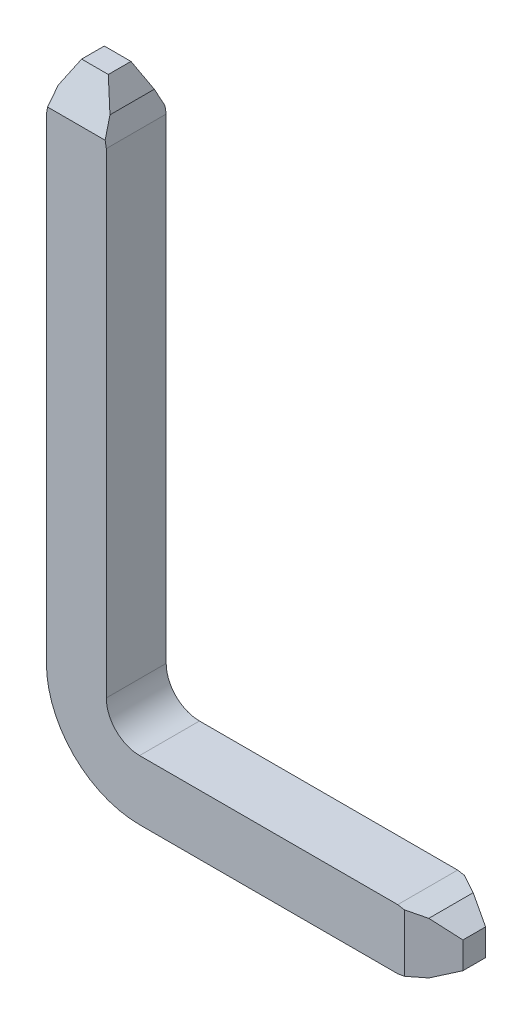
ISO-10303-21;
HEADER;
FILE_DESCRIPTION(('STEP AP214'),'2;1');
FILE_NAME('part.step','',(''),(''),'','','');
FILE_SCHEMA(('AUTOMOTIVE_DESIGN { 1 0 10303 214 1 1 1 1 }'));
ENDSEC;
DATA;
#1=APPLICATION_CONTEXT('core data for automotive mechanical design processes');
#2=APPLICATION_PROTOCOL_DEFINITION('international standard','automotive_design',2000,#1);
#3=PRODUCT_CONTEXT('',#1,'mechanical');
#4=PRODUCT('Part','Part','',(#3));
#5=PRODUCT_RELATED_PRODUCT_CATEGORY('part','',(#4));
#6=PRODUCT_DEFINITION_FORMATION('','',#4);
#7=PRODUCT_DEFINITION_CONTEXT('part definition',#1,'design');
#8=PRODUCT_DEFINITION('design','',#6,#7);
#9=PRODUCT_DEFINITION_SHAPE('','',#8);
#10=(LENGTH_UNIT() NAMED_UNIT(*) SI_UNIT(.MILLI.,.METRE.));
#11=(NAMED_UNIT(*) PLANE_ANGLE_UNIT() SI_UNIT($,.RADIAN.));
#12=(NAMED_UNIT(*) SI_UNIT($,.STERADIAN.) SOLID_ANGLE_UNIT());
#13=UNCERTAINTY_MEASURE_WITH_UNIT(LENGTH_MEASURE(1.E-05),#10,'distance_accuracy_value','');
#14=(GEOMETRIC_REPRESENTATION_CONTEXT(3) GLOBAL_UNCERTAINTY_ASSIGNED_CONTEXT((#13)) GLOBAL_UNIT_ASSIGNED_CONTEXT((#10,
#11,#12)) REPRESENTATION_CONTEXT('',''));
#15=CARTESIAN_POINT('',(0.,0.,0.));
#16=DIRECTION('',(0.,0.,1.));
#17=DIRECTION('',(1.,0.,0.));
#18=AXIS2_PLACEMENT_3D('',#15,#16,#17);
#19=CARTESIAN_POINT('',(7.02309999999993,12.4271795773165,0.571499999999999));
#20=DIRECTION('',(-1.,0.,0.));
#21=DIRECTION('',(0.,-1.,0.));
#22=AXIS2_PLACEMENT_3D('',#19,#20,#21);
#23=PLANE('',#22);
#24=DIRECTION('',(0.,1.,0.));
#25=VECTOR('',#24,1.);
#26=CARTESIAN_POINT('',(7.02309999999998,11.176,0.216173564485865));
#27=LINE('',#26,#25);
#28=CARTESIAN_POINT('',(7.02309999999999,0.254384160478297,0.216173564485887));
#29=VERTEX_POINT('',#28);
#30=CARTESIAN_POINT('',(7.02309999999999,-0.254384160478395,0.216173564485863));
#31=VERTEX_POINT('',#30);
#32=EDGE_CURVE('E279',#29,#31,#27,.F.);
#33=ORIENTED_EDGE('',*,*,#32,.T.);
#34=DIRECTION('',(0.,0.,1.));
#35=VECTOR('',#34,1.);
#36=CARTESIAN_POINT('',(7.0231,-0.254384160478396,-0.571500000000001));
#37=LINE('',#36,#35);
#38=CARTESIAN_POINT('',(7.02309999999998,-0.254384160478394,-0.216173564485855));
#39=VERTEX_POINT('',#38);
#40=EDGE_CURVE('E234',#31,#39,#37,.F.);
#41=ORIENTED_EDGE('',*,*,#40,.T.);
#42=DIRECTION('',(0.,1.,0.));
#43=VECTOR('',#42,1.);
#44=CARTESIAN_POINT('',(7.02309999999999,11.176,-0.216173564485864));
#45=LINE('',#44,#43);
#46=CARTESIAN_POINT('',(7.02309999999998,0.254384160478297,-0.216173564485839));
#47=VERTEX_POINT('',#46);
#48=EDGE_CURVE('E222',#39,#47,#45,.T.);
#49=ORIENTED_EDGE('',*,*,#48,.T.);
#50=DIRECTION('',(0.,0.,1.));
#51=VECTOR('',#50,1.);
#52=CARTESIAN_POINT('',(7.02309999999999,0.254384160478297,-0.571500000000001));
#53=LINE('',#52,#51);
#54=EDGE_CURVE('E233',#47,#29,#53,.T.);
#55=ORIENTED_EDGE('',*,*,#54,.T.);
#56=EDGE_LOOP('',(#33,#41,#49,#55));
#57=FACE_BOUND('',#56,.T.);
#58=ADVANCED_FACE('F15',(#57),#23,.F.);
#59=CARTESIAN_POINT('',(6.5786,-0.493122657075138,-0.571500000000001));
#60=DIRECTION('',(-0.473165915539226,0.880973334654305,0.));
#61=DIRECTION('',(-0.880973334654305,-0.473165915539226,0.));
#62=AXIS2_PLACEMENT_3D('',#59,#60,#61);
#63=PLANE('',#62);
#64=DIRECTION('',(-0.814891923823506,-0.437673954516204,0.379990344647562));
#65=VECTOR('',#64,1.);
#66=CARTESIAN_POINT('',(7.02309999999998,-0.254384160478393,0.216173564485836));
#67=LINE('',#66,#65);
#68=CARTESIAN_POINT('',(6.57859999999999,-0.493122657075138,0.42344731853576));
#69=VERTEX_POINT('',#68);
#70=EDGE_CURVE('E257',#31,#69,#67,.T.);
#71=ORIENTED_EDGE('',*,*,#70,.T.);
#72=DIRECTION('',(0.,0.,1.));
#73=VECTOR('',#72,1.);
#74=CARTESIAN_POINT('',(6.5786,-0.49312265707514,-0.571500000000001));
#75=LINE('',#74,#73);
#76=CARTESIAN_POINT('',(6.57859999999999,-0.493122657075139,-0.423447318535771));
#77=VERTEX_POINT('',#76);
#78=EDGE_CURVE('E196',#69,#77,#75,.F.);
#79=ORIENTED_EDGE('',*,*,#78,.T.);
#80=DIRECTION('',(0.814891923823506,0.437673954516204,0.379990344647562));
#81=VECTOR('',#80,1.);
#82=CARTESIAN_POINT('',(6.57859999999997,-0.493122657075138,-0.423447318535736));
#83=LINE('',#82,#81);
#84=EDGE_CURVE('E254',#77,#39,#83,.T.);
#85=ORIENTED_EDGE('',*,*,#84,.T.);
#86=ORIENTED_EDGE('',*,*,#40,.F.);
#87=EDGE_LOOP('',(#71,#79,#85,#86));
#88=FACE_BOUND('',#87,.T.);
#89=ADVANCED_FACE('F545',(#88),#63,.F.);
#90=CARTESIAN_POINT('',(6.57859999999999,0.493122657075042,-0.571500000000001));
#91=DIRECTION('',(-0.473165915539233,-0.880973334654301,0.));
#92=DIRECTION('',(0.880973334654301,-0.473165915539233,0.));
#93=AXIS2_PLACEMENT_3D('',#90,#91,#92);
#94=PLANE('',#93);
#95=DIRECTION('',(0.814891923823507,-0.4376739545162,-0.379990344647564));
#96=VECTOR('',#95,1.);
#97=CARTESIAN_POINT('',(6.57859999999997,0.493122657075042,0.42344731853574));
#98=LINE('',#97,#96);
#99=CARTESIAN_POINT('',(6.57859999999998,0.493122657075042,0.423447318535775));
#100=VERTEX_POINT('',#99);
#101=EDGE_CURVE('E247',#100,#29,#98,.T.);
#102=ORIENTED_EDGE('',*,*,#101,.T.);
#103=ORIENTED_EDGE('',*,*,#54,.F.);
#104=DIRECTION('',(-0.814891923823508,0.437673954516198,-0.379990344647565));
#105=VECTOR('',#104,1.);
#106=CARTESIAN_POINT('',(7.02309999999997,0.254384160478301,-0.216173564485842));
#107=LINE('',#106,#105);
#108=CARTESIAN_POINT('',(6.57859999999998,0.493122657075042,-0.423447318535773));
#109=VERTEX_POINT('',#108);
#110=EDGE_CURVE('E209',#47,#109,#107,.T.);
#111=ORIENTED_EDGE('',*,*,#110,.T.);
#112=DIRECTION('',(0.,0.,1.));
#113=VECTOR('',#112,1.);
#114=CARTESIAN_POINT('',(6.57859999999999,0.493122657075041,-0.571500000000001));
#115=LINE('',#114,#113);
#116=EDGE_CURVE('E218',#109,#100,#115,.T.);
#117=ORIENTED_EDGE('',*,*,#116,.T.);
#118=EDGE_LOOP('',(#102,#103,#111,#117));
#119=FACE_BOUND('',#118,.T.);
#120=ADVANCED_FACE('F537',(#119),#94,.F.);
#121=CARTESIAN_POINT('',(7.02309999999994,11.176,0.216173564485887));
#122=DIRECTION('',(-0.422618261740701,0.,-0.906307787036649));
#123=DIRECTION('',(-0.906307787036649,0.,0.422618261740701));
#124=AXIS2_PLACEMENT_3D('',#121,#122,#123);
#125=PLANE('',#124);
#126=ORIENTED_EDGE('',*,*,#32,.F.);
#127=ORIENTED_EDGE('',*,*,#101,.F.);
#128=DIRECTION('',(-0.894952131932454,0.157804207302252,0.417323032802243));
#129=VECTOR('',#128,1.);
#130=CARTESIAN_POINT('',(6.57859999999999,0.493122657075041,0.423447318535787));
#131=LINE('',#130,#129);
#132=CARTESIAN_POINT('',(6.26109999999999,0.549106473449978,0.571499999999981));
#133=VERTEX_POINT('',#132);
#134=EDGE_CURVE('E213',#100,#133,#131,.T.);
#135=ORIENTED_EDGE('',*,*,#134,.T.);
#136=DIRECTION('',(0.,1.,0.));
#137=VECTOR('',#136,1.);
#138=CARTESIAN_POINT('',(6.26109999999999,11.176,0.571499999999973));
#139=LINE('',#138,#137);
#140=CARTESIAN_POINT('',(6.26109999999999,-0.549106473450073,0.571499999999981));
#141=VERTEX_POINT('',#140);
#142=EDGE_CURVE('E244',#141,#133,#139,.T.);
#143=ORIENTED_EDGE('',*,*,#142,.F.);
#144=DIRECTION('',(0.894952131932453,0.157804207302242,-0.41732303280225));
#145=VECTOR('',#144,1.);
#146=CARTESIAN_POINT('',(6.2611,-0.549106473450073,0.571499999999997));
#147=LINE('',#146,#145);
#148=EDGE_CURVE('E238',#141,#69,#147,.T.);
#149=ORIENTED_EDGE('',*,*,#148,.T.);
#150=ORIENTED_EDGE('',*,*,#70,.F.);
#151=EDGE_LOOP('',(#126,#127,#135,#143,#149,#150));
#152=FACE_BOUND('',#151,.T.);
#153=ADVANCED_FACE('F530',(#152),#125,.F.);
#154=CARTESIAN_POINT('',(7.02309999999994,11.176,-0.216173564485889));
#155=DIRECTION('',(-0.422618261740702,0.,0.906307787036649));
#156=DIRECTION('',(0.906307787036649,0.,0.422618261740702));
#157=AXIS2_PLACEMENT_3D('',#154,#155,#156);
#158=PLANE('',#157);
#159=DIRECTION('',(0.894952131932453,-0.157804207302252,0.417323032802247));
#160=VECTOR('',#159,1.);
#161=CARTESIAN_POINT('',(6.26109999999999,0.549106473449978,-0.571500000000001));
#162=LINE('',#161,#160);
#163=CARTESIAN_POINT('',(6.26109999999999,0.549106473449979,-0.5715));
#164=VERTEX_POINT('',#163);
#165=EDGE_CURVE('E190',#164,#109,#162,.T.);
#166=ORIENTED_EDGE('',*,*,#165,.T.);
#167=ORIENTED_EDGE('',*,*,#110,.F.);
#168=ORIENTED_EDGE('',*,*,#48,.F.);
#169=ORIENTED_EDGE('',*,*,#84,.F.);
#170=DIRECTION('',(-0.894952131932453,-0.157804207302242,-0.41732303280225));
#171=VECTOR('',#170,1.);
#172=CARTESIAN_POINT('',(6.5786,-0.49312265707514,-0.423447318535788));
#173=LINE('',#172,#171);
#174=CARTESIAN_POINT('',(6.26109999999999,-0.549106473450074,-0.571500000000001));
#175=VERTEX_POINT('',#174);
#176=EDGE_CURVE('E206',#77,#175,#173,.T.);
#177=ORIENTED_EDGE('',*,*,#176,.T.);
#178=DIRECTION('',(0.,1.,0.));
#179=VECTOR('',#178,1.);
#180=CARTESIAN_POINT('',(6.26109999999999,12.4271795773165,-0.571499999999999));
#181=LINE('',#180,#179);
#182=EDGE_CURVE('E203',#164,#175,#181,.F.);
#183=ORIENTED_EDGE('',*,*,#182,.F.);
#184=EDGE_LOOP('',(#166,#167,#168,#169,#177,#183));
#185=FACE_BOUND('',#184,.T.);
#186=ADVANCED_FACE('F376',(#185),#158,.F.);
#187=CARTESIAN_POINT('',(6.1341,-0.571500000000047,-0.571500000000001));
#188=DIRECTION('',(-0.173648177666919,0.98480775301221,0.));
#189=DIRECTION('',(-0.98480775301221,-0.173648177666919,0.));
#190=AXIS2_PLACEMENT_3D('',#187,#188,#189);
#191=PLANE('',#190);
#192=ORIENTED_EDGE('',*,*,#148,.F.);
#193=DIRECTION('',(-0.98480775301221,-0.173648177666919,0.));
#194=VECTOR('',#193,1.);
#195=CARTESIAN_POINT('',(6.1341,-0.571500000000047,0.571499999999999));
#196=LINE('',#195,#194);
#197=CARTESIAN_POINT('',(6.13410000000001,-0.57149999999999,0.571499999999999));
#198=VERTEX_POINT('',#197);
#199=EDGE_CURVE('E208',#198,#141,#196,.F.);
#200=ORIENTED_EDGE('',*,*,#199,.F.);
#201=DIRECTION('',(0.,0.,1.));
#202=VECTOR('',#201,1.);
#203=CARTESIAN_POINT('',(6.1341,-0.571499999999962,0.571499999999999));
#204=LINE('',#203,#202);
#205=CARTESIAN_POINT('',(6.1341,-0.571500000000019,-0.571499999999999));
#206=VERTEX_POINT('',#205);
#207=EDGE_CURVE('E161',#198,#206,#204,.F.);
#208=ORIENTED_EDGE('',*,*,#207,.T.);
#209=DIRECTION('',(-0.984807753012207,-0.173648177666939,0.));
#210=VECTOR('',#209,1.);
#211=CARTESIAN_POINT('',(6.2611,-0.549106473450071,-0.571499999999999));
#212=LINE('',#211,#210);
#213=EDGE_CURVE('E200',#175,#206,#212,.T.);
#214=ORIENTED_EDGE('',*,*,#213,.F.);
#215=ORIENTED_EDGE('',*,*,#176,.F.);
#216=ORIENTED_EDGE('',*,*,#78,.F.);
#217=EDGE_LOOP('',(#192,#200,#208,#214,#215,#216));
#218=FACE_BOUND('',#217,.T.);
#219=ADVANCED_FACE('F383',(#218),#191,.F.);
#220=CARTESIAN_POINT('',(0.,-0.571499999999999,0.571499999999999));
#221=DIRECTION('',(0.,1.,0.));
#222=DIRECTION('',(-1.,0.,0.));
#223=AXIS2_PLACEMENT_3D('',#220,#221,#222);
#224=PLANE('',#223);
#225=ORIENTED_EDGE('',*,*,#207,.F.);
#226=DIRECTION('',(-1.,0.,0.));
#227=VECTOR('',#226,1.);
#228=CARTESIAN_POINT('',(0.,-0.571499999999999,0.571499999999999));
#229=LINE('',#228,#227);
#230=CARTESIAN_POINT('',(1.20650000000001,-0.571499999999996,0.571499999999999));
#231=VERTEX_POINT('',#230);
#232=EDGE_CURVE('E195',#231,#198,#229,.F.);
#233=ORIENTED_EDGE('',*,*,#232,.F.);
#234=DIRECTION('',(0.,0.,1.));
#235=VECTOR('',#234,1.);
#236=CARTESIAN_POINT('',(1.2065,-0.571499999999992,0.571499999999999));
#237=LINE('',#236,#235);
#238=CARTESIAN_POINT('',(1.2065,-0.57150000000002,-0.571499999999999));
#239=VERTEX_POINT('',#238);
#240=EDGE_CURVE('E193',#239,#231,#237,.T.);
#241=ORIENTED_EDGE('',*,*,#240,.F.);
#242=DIRECTION('',(1.,0.,0.));
#243=VECTOR('',#242,1.);
#244=CARTESIAN_POINT('',(0.,-0.571500000000048,-0.571499999999999));
#245=LINE('',#244,#243);
#246=EDGE_CURVE('E172',#206,#239,#245,.F.);
#247=ORIENTED_EDGE('',*,*,#246,.F.);
#248=EDGE_LOOP('',(#225,#233,#241,#247));
#249=FACE_BOUND('',#248,.T.);
#250=ADVANCED_FACE('F388',(#249),#224,.F.);
#251=CARTESIAN_POINT('',(0.,0.571499999999999,0.571499999999999));
#252=DIRECTION('',(0.,1.,0.));
#253=DIRECTION('',(-1.,0.,0.));
#254=AXIS2_PLACEMENT_3D('',#251,#252,#253);
#255=PLANE('',#254);
#256=DIRECTION('',(0.,0.,1.));
#257=VECTOR('',#256,1.);
#258=CARTESIAN_POINT('',(1.20649999999999,0.571500000000006,0.571499999999999));
#259=LINE('',#258,#257);
#260=CARTESIAN_POINT('',(1.2065,0.571500000000003,-0.571499999999999));
#261=VERTEX_POINT('',#260);
#262=CARTESIAN_POINT('',(1.2065,0.571500000000003,0.571499999999999));
#263=VERTEX_POINT('',#262);
#264=EDGE_CURVE('E153',#261,#263,#259,.T.);
#265=ORIENTED_EDGE('',*,*,#264,.T.);
#266=DIRECTION('',(-1.,0.,0.));
#267=VECTOR('',#266,1.);
#268=CARTESIAN_POINT('',(0.,0.571499999999999,0.571499999999999));
#269=LINE('',#268,#267);
#270=CARTESIAN_POINT('',(6.13409999999988,0.5715,0.571499999999999));
#271=VERTEX_POINT('',#270);
#272=EDGE_CURVE('E160',#263,#271,#269,.F.);
#273=ORIENTED_EDGE('',*,*,#272,.T.);
#274=DIRECTION('',(0.,0.,1.));
#275=VECTOR('',#274,1.);
#276=CARTESIAN_POINT('',(6.13409999999999,0.571499999999953,-0.571500000000001));
#277=LINE('',#276,#275);
#278=CARTESIAN_POINT('',(6.13409999999978,0.571499999999988,-0.571499999999999));
#279=VERTEX_POINT('',#278);
#280=EDGE_CURVE('E167',#271,#279,#277,.F.);
#281=ORIENTED_EDGE('',*,*,#280,.T.);
#282=DIRECTION('',(1.,0.,0.));
#283=VECTOR('',#282,1.);
#284=CARTESIAN_POINT('',(0.,0.571499999999999,-0.571499999999999));
#285=LINE('',#284,#283);
#286=EDGE_CURVE('E164',#261,#279,#285,.T.);
#287=ORIENTED_EDGE('',*,*,#286,.F.);
#288=EDGE_LOOP('',(#265,#273,#281,#287));
#289=FACE_BOUND('',#288,.T.);
#290=ADVANCED_FACE('F165',(#289),#255,.T.);
#291=CARTESIAN_POINT('',(6.13409999999999,0.571499999999953,-0.571500000000001));
#292=DIRECTION('',(-0.173648177666929,-0.984807753012208,0.));
#293=DIRECTION('',(0.984807753012208,-0.173648177666929,0.));
#294=AXIS2_PLACEMENT_3D('',#291,#292,#293);
#295=PLANE('',#294);
#296=ORIENTED_EDGE('',*,*,#134,.F.);
#297=ORIENTED_EDGE('',*,*,#116,.F.);
#298=ORIENTED_EDGE('',*,*,#165,.F.);
#299=DIRECTION('',(0.984807753012207,-0.173648177666939,0.));
#300=VECTOR('',#299,1.);
#301=CARTESIAN_POINT('',(6.13409999999999,0.571499999999954,-0.571499999999999));
#302=LINE('',#301,#300);
#303=EDGE_CURVE('E171',#279,#164,#302,.T.);
#304=ORIENTED_EDGE('',*,*,#303,.F.);
#305=ORIENTED_EDGE('',*,*,#280,.F.);
#306=DIRECTION('',(0.984807753012207,-0.173648177666939,0.));
#307=VECTOR('',#306,1.);
#308=CARTESIAN_POINT('',(6.13409999999999,0.571499999999954,0.571499999999999));
#309=LINE('',#308,#307);
#310=EDGE_CURVE('E231',#271,#133,#309,.T.);
#311=ORIENTED_EDGE('',*,*,#310,.T.);
#312=EDGE_LOOP('',(#296,#297,#298,#304,#305,#311));
#313=FACE_BOUND('',#312,.T.);
#314=ADVANCED_FACE('F371',(#313),#295,.F.);
#315=CARTESIAN_POINT('',(1.2065,1.2065,-18.3265009058992));
#316=DIRECTION('',(0.,0.,1.));
#317=DIRECTION('',(0.,-1.,0.));
#318=AXIS2_PLACEMENT_3D('',#315,#316,#317);
#319=CYLINDRICAL_SURFACE('',#318,1.778);
#320=CARTESIAN_POINT('',(1.2065,1.2065,0.571499999999999));
#321=DIRECTION('',(0.,0.,1.));
#322=DIRECTION('',(0.,-1.,0.));
#323=AXIS2_PLACEMENT_3D('',#320,#321,#322);
#324=CIRCLE('',#323,1.778);
#325=CARTESIAN_POINT('',(-0.571500000000005,1.20649999999999,0.571499999999999));
#326=VERTEX_POINT('',#325);
#327=EDGE_CURVE('E291',#326,#231,#324,.T.);
#328=ORIENTED_EDGE('',*,*,#327,.F.);
#329=DIRECTION('',(0.,0.,1.));
#330=VECTOR('',#329,1.);
#331=CARTESIAN_POINT('',(-0.571500000000004,1.2065,-18.3265009058992));
#332=LINE('',#331,#330);
#333=CARTESIAN_POINT('',(-0.571500000000007,1.2065,-0.571499999999999));
#334=VERTEX_POINT('',#333);
#335=EDGE_CURVE('E182',#326,#334,#332,.F.);
#336=ORIENTED_EDGE('',*,*,#335,.T.);
#337=CARTESIAN_POINT('',(1.2065,1.2065,-0.571499999999999));
#338=DIRECTION('',(0.,0.,1.));
#339=DIRECTION('',(0.,-1.,0.));
#340=AXIS2_PLACEMENT_3D('',#337,#338,#339);
#341=CIRCLE('',#340,1.778);
#342=EDGE_CURVE('E180',#334,#239,#341,.T.);
#343=ORIENTED_EDGE('',*,*,#342,.T.);
#344=ORIENTED_EDGE('',*,*,#240,.T.);
#345=EDGE_LOOP('',(#328,#336,#343,#344));
#346=FACE_BOUND('',#345,.T.);
#347=ADVANCED_FACE('F389',(#346),#319,.T.);
#348=CARTESIAN_POINT('',(20.6411167626589,11.1759999999999,0.571499999999998));
#349=DIRECTION('',(0.,1.,0.));
#350=DIRECTION('',(-1.,0.,0.));
#351=AXIS2_PLACEMENT_3D('',#348,#349,#350);
#352=PLANE('',#351);
#353=DIRECTION('',(1.,0.,0.));
#354=VECTOR('',#353,1.);
#355=CARTESIAN_POINT('',(8.06449999999995,11.176,0.216173564485853));
#356=LINE('',#355,#354);
#357=CARTESIAN_POINT('',(-0.254384160478419,11.176,0.216173564485861));
#358=VERTEX_POINT('',#357);
#359=CARTESIAN_POINT('',(0.254384160478283,11.176,0.216173564485875));
#360=VERTEX_POINT('',#359);
#361=EDGE_CURVE('E359',#358,#360,#356,.T.);
#362=ORIENTED_EDGE('',*,*,#361,.T.);
#363=DIRECTION('',(0.,0.,1.));
#364=VECTOR('',#363,1.);
#365=CARTESIAN_POINT('',(0.254384160478283,11.176,-0.571499999999999));
#366=LINE('',#365,#364);
#367=CARTESIAN_POINT('',(0.254384160478283,11.176,-0.216173564485872));
#368=VERTEX_POINT('',#367);
#369=EDGE_CURVE('E290',#360,#368,#366,.F.);
#370=ORIENTED_EDGE('',*,*,#369,.T.);
#371=DIRECTION('',(1.,0.,0.));
#372=VECTOR('',#371,1.);
#373=CARTESIAN_POINT('',(8.06449999999995,11.176,-0.216173564485852));
#374=LINE('',#373,#372);
#375=CARTESIAN_POINT('',(-0.254384160478416,11.176,-0.216173564485872));
#376=VERTEX_POINT('',#375);
#377=EDGE_CURVE('E341',#368,#376,#374,.F.);
#378=ORIENTED_EDGE('',*,*,#377,.T.);
#379=DIRECTION('',(0.,0.,1.));
#380=VECTOR('',#379,1.);
#381=CARTESIAN_POINT('',(-0.254384160478416,11.176,-0.571499999999999));
#382=LINE('',#381,#380);
#383=EDGE_CURVE('E349',#376,#358,#382,.T.);
#384=ORIENTED_EDGE('',*,*,#383,.T.);
#385=EDGE_LOOP('',(#362,#370,#378,#384));
#386=FACE_BOUND('',#385,.T.);
#387=ADVANCED_FACE('F413',(#386),#352,.T.);
#388=CARTESIAN_POINT('',(0.493122657075027,10.7315,-0.571499999999999));
#389=DIRECTION('',(-0.880973334654302,-0.473165915539231,0.));
#390=DIRECTION('',(0.473165915539231,-0.880973334654302,0.));
#391=AXIS2_PLACEMENT_3D('',#388,#389,#390);
#392=PLANE('',#391);
#393=DIRECTION('',(-0.437673954516204,0.814891923823505,0.379990344647565));
#394=VECTOR('',#393,1.);
#395=CARTESIAN_POINT('',(0.493122657075028,10.7315,-0.423447318535734));
#396=LINE('',#395,#394);
#397=CARTESIAN_POINT('',(0.493122657075028,10.7315,-0.423447318535772));
#398=VERTEX_POINT('',#397);
#399=EDGE_CURVE('E344',#398,#368,#396,.T.);
#400=ORIENTED_EDGE('',*,*,#399,.T.);
#401=ORIENTED_EDGE('',*,*,#369,.F.);
#402=DIRECTION('',(0.437673954516203,-0.814891923823505,0.379990344647565));
#403=VECTOR('',#402,1.);
#404=CARTESIAN_POINT('',(0.254384160478279,11.176,0.216173564485834));
#405=LINE('',#404,#403);
#406=CARTESIAN_POINT('',(0.493122657075026,10.7315,0.42344731853576));
#407=VERTEX_POINT('',#406);
#408=EDGE_CURVE('E357',#360,#407,#405,.T.);
#409=ORIENTED_EDGE('',*,*,#408,.T.);
#410=DIRECTION('',(0.,0.,1.));
#411=VECTOR('',#410,1.);
#412=CARTESIAN_POINT('',(0.493122657075029,10.7315,-0.571499999999999));
#413=LINE('',#412,#411);
#414=EDGE_CURVE('E334',#407,#398,#413,.F.);
#415=ORIENTED_EDGE('',*,*,#414,.T.);
#416=EDGE_LOOP('',(#400,#401,#409,#415));
#417=FACE_BOUND('',#416,.T.);
#418=ADVANCED_FACE('F416',(#417),#392,.F.);
#419=CARTESIAN_POINT('',(1.2065,1.2065,-18.3265009058992));
#420=DIRECTION('',(0.,0.,1.));
#421=DIRECTION('',(0.,-1.,0.));
#422=AXIS2_PLACEMENT_3D('',#419,#420,#421);
#423=CYLINDRICAL_SURFACE('',#422,0.635);
#424=DIRECTION('',(0.,0.,1.));
#425=VECTOR('',#424,1.);
#426=CARTESIAN_POINT('',(0.571499999999994,1.2065,0.571499999999999));
#427=LINE('',#426,#425);
#428=CARTESIAN_POINT('',(0.571499999999995,1.2065,0.571499999999999));
#429=VERTEX_POINT('',#428);
#430=CARTESIAN_POINT('',(0.571499999999968,1.2065,-0.5715));
#431=VERTEX_POINT('',#430);
#432=EDGE_CURVE('E362',#429,#431,#427,.F.);
#433=ORIENTED_EDGE('',*,*,#432,.F.);
#434=CARTESIAN_POINT('',(1.2065,1.2065,0.571499999999999));
#435=DIRECTION('',(0.,0.,1.));
#436=DIRECTION('',(0.,-1.,0.));
#437=AXIS2_PLACEMENT_3D('',#434,#435,#436);
#438=CIRCLE('',#437,0.635);
#439=EDGE_CURVE('E156',#263,#429,#438,.F.);
#440=ORIENTED_EDGE('',*,*,#439,.F.);
#441=ORIENTED_EDGE('',*,*,#264,.F.);
#442=CARTESIAN_POINT('',(1.2065,1.2065,-0.571499999999999));
#443=DIRECTION('',(0.,0.,1.));
#444=DIRECTION('',(0.,-1.,0.));
#445=AXIS2_PLACEMENT_3D('',#442,#443,#444);
#446=CIRCLE('',#445,0.635);
#447=EDGE_CURVE('E18',#431,#261,#446,.T.);
#448=ORIENTED_EDGE('',*,*,#447,.F.);
#449=EDGE_LOOP('',(#433,#440,#441,#448));
#450=FACE_BOUND('',#449,.T.);
#451=ADVANCED_FACE('F155',(#450),#423,.F.);
#452=CARTESIAN_POINT('',(20.6411167626589,11.1759999999999,0.571499999999998));
#453=DIRECTION('',(0.,0.,-1.));
#454=DIRECTION('',(0.,1.,0.));
#455=AXIS2_PLACEMENT_3D('',#452,#453,#454);
#456=PLANE('',#455);
#457=DIRECTION('',(1.,0.,0.));
#458=VECTOR('',#457,1.);
#459=CARTESIAN_POINT('',(8.06449999999995,10.414,0.571499999999965));
#460=LINE('',#459,#458);
#461=CARTESIAN_POINT('',(0.549106473449965,10.414,0.571499999999986));
#462=VERTEX_POINT('',#461);
#463=CARTESIAN_POINT('',(-0.549106473450089,10.414,0.571499999999985));
#464=VERTEX_POINT('',#463);
#465=EDGE_CURVE('E354',#462,#464,#460,.F.);
#466=ORIENTED_EDGE('',*,*,#465,.T.);
#467=DIRECTION('',(0.173648177666913,0.984807753012211,0.));
#468=VECTOR('',#467,1.);
#469=CARTESIAN_POINT('',(-0.571500000000062,10.287,0.571499999999998));
#470=LINE('',#469,#468);
#471=CARTESIAN_POINT('',(-0.571500000000035,10.2870000000001,0.571499999999999));
#472=VERTEX_POINT('',#471);
#473=EDGE_CURVE('E289',#472,#464,#470,.T.);
#474=ORIENTED_EDGE('',*,*,#473,.F.);
#475=DIRECTION('',(0.,1.,0.));
#476=VECTOR('',#475,1.);
#477=CARTESIAN_POINT('',(-0.571500000000066,11.176,0.571499999999999));
#478=LINE('',#477,#476);
#479=EDGE_CURVE('E303',#472,#326,#478,.F.);
#480=ORIENTED_EDGE('',*,*,#479,.T.);
#481=ORIENTED_EDGE('',*,*,#327,.T.);
#482=ORIENTED_EDGE('',*,*,#232,.T.);
#483=ORIENTED_EDGE('',*,*,#199,.T.);
#484=ORIENTED_EDGE('',*,*,#142,.T.);
#485=ORIENTED_EDGE('',*,*,#310,.F.);
#486=ORIENTED_EDGE('',*,*,#272,.F.);
#487=ORIENTED_EDGE('',*,*,#439,.T.);
#488=DIRECTION('',(0.,1.,0.));
#489=VECTOR('',#488,1.);
#490=CARTESIAN_POINT('',(0.571499999999934,11.176,0.571499999999999));
#491=LINE('',#490,#489);
#492=CARTESIAN_POINT('',(0.57149999999994,10.287,0.571499999999999));
#493=VERTEX_POINT('',#492);
#494=EDGE_CURVE('E331',#493,#429,#491,.F.);
#495=ORIENTED_EDGE('',*,*,#494,.F.);
#496=DIRECTION('',(0.173648177666928,-0.984807753012208,0.));
#497=VECTOR('',#496,1.);
#498=CARTESIAN_POINT('',(0.571499999999941,10.287,0.5715));
#499=LINE('',#498,#497);
#500=EDGE_CURVE('E339',#493,#462,#499,.F.);
#501=ORIENTED_EDGE('',*,*,#500,.T.);
#502=EDGE_LOOP('',(#466,#474,#480,#481,#482,#483,#484,#485,#486,#487,#495,#501));
#503=FACE_BOUND('',#502,.T.);
#504=ADVANCED_FACE('F367',(#503),#456,.F.);
#505=CARTESIAN_POINT('',(8.06449999999995,11.1759999999999,0.216173564485887));
#506=DIRECTION('',(0.,-0.422618261740703,-0.906307787036649));
#507=DIRECTION('',(0.,0.906307787036649,-0.422618261740703));
#508=AXIS2_PLACEMENT_3D('',#505,#506,#507);
#509=PLANE('',#508);
#510=ORIENTED_EDGE('',*,*,#465,.F.);
#511=DIRECTION('',(-0.157804207302252,0.894952131932453,-0.417323032802246));
#512=VECTOR('',#511,1.);
#513=CARTESIAN_POINT('',(0.549106473449966,10.414,0.5715));
#514=LINE('',#513,#512);
#515=EDGE_CURVE('E336',#462,#407,#514,.T.);
#516=ORIENTED_EDGE('',*,*,#515,.T.);
#517=ORIENTED_EDGE('',*,*,#408,.F.);
#518=ORIENTED_EDGE('',*,*,#361,.F.);
#519=DIRECTION('',(-0.437673954516196,-0.81489192382351,0.379990344647564));
#520=VECTOR('',#519,1.);
#521=CARTESIAN_POINT('',(-0.254384160478416,11.176,0.216173564485889));
#522=LINE('',#521,#520);
#523=CARTESIAN_POINT('',(-0.493122657075156,10.7315,0.423447318535759));
#524=VERTEX_POINT('',#523);
#525=EDGE_CURVE('E352',#358,#524,#522,.T.);
#526=ORIENTED_EDGE('',*,*,#525,.T.);
#527=DIRECTION('',(-0.157804207302242,-0.894952131932455,0.417323032802247));
#528=VECTOR('',#527,1.);
#529=CARTESIAN_POINT('',(-0.493122657075153,10.7315,0.423447318535787));
#530=LINE('',#529,#528);
#531=EDGE_CURVE('E325',#524,#464,#530,.T.);
#532=ORIENTED_EDGE('',*,*,#531,.T.);
#533=EDGE_LOOP('',(#510,#516,#517,#518,#526,#532));
#534=FACE_BOUND('',#533,.T.);
#535=ADVANCED_FACE('F408',(#534),#509,.F.);
#536=CARTESIAN_POINT('',(-0.493122657075155,10.7315,-0.571499999999999));
#537=DIRECTION('',(0.880973334654306,-0.473165915539224,0.));
#538=DIRECTION('',(0.473165915539224,0.880973334654306,0.));
#539=AXIS2_PLACEMENT_3D('',#536,#537,#538);
#540=PLANE('',#539);
#541=DIRECTION('',(-0.437673954516197,-0.814891923823509,-0.379990344647564));
#542=VECTOR('',#541,1.);
#543=CARTESIAN_POINT('',(-0.254384160478415,11.176,-0.216173564485833));
#544=LINE('',#543,#542);
#545=CARTESIAN_POINT('',(-0.493122657075155,10.7315,-0.423447318535758));
#546=VERTEX_POINT('',#545);
#547=EDGE_CURVE('E347',#376,#546,#544,.T.);
#548=ORIENTED_EDGE('',*,*,#547,.T.);
#549=DIRECTION('',(0.,0.,1.));
#550=VECTOR('',#549,1.);
#551=CARTESIAN_POINT('',(-0.493122657075153,10.7315,-0.571499999999999));
#552=LINE('',#551,#550);
#553=EDGE_CURVE('E316',#546,#524,#552,.T.);
#554=ORIENTED_EDGE('',*,*,#553,.T.);
#555=ORIENTED_EDGE('',*,*,#525,.F.);
#556=ORIENTED_EDGE('',*,*,#383,.F.);
#557=EDGE_LOOP('',(#548,#554,#555,#556));
#558=FACE_BOUND('',#557,.T.);
#559=ADVANCED_FACE('F411',(#558),#540,.F.);
#560=CARTESIAN_POINT('',(8.06449999999995,11.1759999999999,-0.216173564485887));
#561=DIRECTION('',(0.,-0.422618261740702,0.906307787036649));
#562=DIRECTION('',(0.,-0.906307787036649,-0.422618261740702));
#563=AXIS2_PLACEMENT_3D('',#560,#561,#562);
#564=PLANE('',#563);
#565=ORIENTED_EDGE('',*,*,#399,.F.);
#566=DIRECTION('',(0.157804207302251,-0.894952131932451,-0.417323032802251));
#567=VECTOR('',#566,1.);
#568=CARTESIAN_POINT('',(0.493122657075029,10.7315,-0.423447318535785));
#569=LINE('',#568,#567);
#570=CARTESIAN_POINT('',(0.549106473449967,10.414,-0.571499999999974));
#571=VERTEX_POINT('',#570);
#572=EDGE_CURVE('E332',#398,#571,#569,.T.);
#573=ORIENTED_EDGE('',*,*,#572,.T.);
#574=DIRECTION('',(1.,0.,0.));
#575=VECTOR('',#574,1.);
#576=CARTESIAN_POINT('',(20.6411167626589,10.414,-0.571500000000001));
#577=LINE('',#576,#575);
#578=CARTESIAN_POINT('',(-0.549106473450086,10.414,-0.571499999999973));
#579=VERTEX_POINT('',#578);
#580=EDGE_CURVE('E312',#579,#571,#577,.T.);
#581=ORIENTED_EDGE('',*,*,#580,.F.);
#582=DIRECTION('',(0.157804207302241,0.894952131932453,0.417323032802251));
#583=VECTOR('',#582,1.);
#584=CARTESIAN_POINT('',(-0.549106473450087,10.414,-0.571499999999999));
#585=LINE('',#584,#583);
#586=EDGE_CURVE('E321',#579,#546,#585,.T.);
#587=ORIENTED_EDGE('',*,*,#586,.T.);
#588=ORIENTED_EDGE('',*,*,#547,.F.);
#589=ORIENTED_EDGE('',*,*,#377,.F.);
#590=EDGE_LOOP('',(#565,#573,#581,#587,#588,#589));
#591=FACE_BOUND('',#590,.T.);
#592=ADVANCED_FACE('F398',(#591),#564,.F.);
#593=CARTESIAN_POINT('',(0.571499999999941,10.287,-0.571499999999999));
#594=DIRECTION('',(-0.984807753012208,-0.173648177666928,0.));
#595=DIRECTION('',(0.173648177666928,-0.984807753012208,0.));
#596=AXIS2_PLACEMENT_3D('',#593,#594,#595);
#597=PLANE('',#596);
#598=ORIENTED_EDGE('',*,*,#572,.F.);
#599=ORIENTED_EDGE('',*,*,#414,.F.);
#600=ORIENTED_EDGE('',*,*,#515,.F.);
#601=ORIENTED_EDGE('',*,*,#500,.F.);
#602=DIRECTION('',(0.,0.,1.));
#603=VECTOR('',#602,1.);
#604=CARTESIAN_POINT('',(0.571499999999939,10.287,0.571499999999999));
#605=LINE('',#604,#603);
#606=CARTESIAN_POINT('',(0.57149999999994,10.287,-0.5715));
#607=VERTEX_POINT('',#606);
#608=EDGE_CURVE('E328',#607,#493,#605,.T.);
#609=ORIENTED_EDGE('',*,*,#608,.F.);
#610=DIRECTION('',(0.173648177666913,-0.984807753012211,0.));
#611=VECTOR('',#610,1.);
#612=CARTESIAN_POINT('',(0.549106473449967,10.414,-0.571500000000001));
#613=LINE('',#612,#611);
#614=EDGE_CURVE('E311',#571,#607,#613,.T.);
#615=ORIENTED_EDGE('',*,*,#614,.F.);
#616=EDGE_LOOP('',(#598,#599,#600,#601,#609,#615));
#617=FACE_BOUND('',#616,.T.);
#618=ADVANCED_FACE('F404',(#617),#597,.F.);
#619=CARTESIAN_POINT('',(0.571499999999934,11.176,0.571499999999999));
#620=DIRECTION('',(1.,0.,0.));
#621=DIRECTION('',(0.,1.,0.));
#622=AXIS2_PLACEMENT_3D('',#619,#620,#621);
#623=PLANE('',#622);
#624=ORIENTED_EDGE('',*,*,#432,.T.);
#625=DIRECTION('',(0.,1.,0.));
#626=VECTOR('',#625,1.);
#627=CARTESIAN_POINT('',(0.57149999999994,11.1759999999999,-0.571500000000001));
#628=LINE('',#627,#626);
#629=EDGE_CURVE('E178',#607,#431,#628,.F.);
#630=ORIENTED_EDGE('',*,*,#629,.F.);
#631=ORIENTED_EDGE('',*,*,#608,.T.);
#632=ORIENTED_EDGE('',*,*,#494,.T.);
#633=EDGE_LOOP('',(#624,#630,#631,#632));
#634=FACE_BOUND('',#633,.T.);
#635=ADVANCED_FACE('F366',(#634),#623,.T.);
#636=CARTESIAN_POINT('',(-0.571500000000066,11.176,0.571499999999999));
#637=DIRECTION('',(1.,0.,0.));
#638=DIRECTION('',(0.,1.,0.));
#639=AXIS2_PLACEMENT_3D('',#636,#637,#638);
#640=PLANE('',#639);
#641=DIRECTION('',(0.,0.,1.));
#642=VECTOR('',#641,1.);
#643=CARTESIAN_POINT('',(-0.57150000000006,10.287,-0.571499999999999));
#644=LINE('',#643,#642);
#645=CARTESIAN_POINT('',(-0.571500000000048,10.2870000000001,-0.5715));
#646=VERTEX_POINT('',#645);
#647=EDGE_CURVE('E33',#472,#646,#644,.F.);
#648=ORIENTED_EDGE('',*,*,#647,.T.);
#649=DIRECTION('',(0.,1.,0.));
#650=VECTOR('',#649,1.);
#651=CARTESIAN_POINT('',(-0.571500000000009,11.1759999999999,-0.571500000000001));
#652=LINE('',#651,#650);
#653=EDGE_CURVE('E24',#334,#646,#652,.T.);
#654=ORIENTED_EDGE('',*,*,#653,.F.);
#655=ORIENTED_EDGE('',*,*,#335,.F.);
#656=ORIENTED_EDGE('',*,*,#479,.F.);
#657=EDGE_LOOP('',(#648,#654,#655,#656));
#658=FACE_BOUND('',#657,.T.);
#659=ADVANCED_FACE('F390',(#658),#640,.F.);
#660=CARTESIAN_POINT('',(-0.57150000000006,10.287,-0.571499999999999));
#661=DIRECTION('',(0.98480775301221,-0.173648177666918,0.));
#662=DIRECTION('',(0.173648177666918,0.98480775301221,0.));
#663=AXIS2_PLACEMENT_3D('',#660,#661,#662);
#664=PLANE('',#663);
#665=ORIENTED_EDGE('',*,*,#586,.F.);
#666=DIRECTION('',(0.173648177666939,0.984807753012207,0.));
#667=VECTOR('',#666,1.);
#668=CARTESIAN_POINT('',(-0.571500000000062,10.287,-0.571500000000001));
#669=LINE('',#668,#667);
#670=EDGE_CURVE('E10',#646,#579,#669,.T.);
#671=ORIENTED_EDGE('',*,*,#670,.F.);
#672=ORIENTED_EDGE('',*,*,#647,.F.);
#673=ORIENTED_EDGE('',*,*,#473,.T.);
#674=ORIENTED_EDGE('',*,*,#531,.F.);
#675=ORIENTED_EDGE('',*,*,#553,.F.);
#676=EDGE_LOOP('',(#665,#671,#672,#673,#674,#675));
#677=FACE_BOUND('',#676,.T.);
#678=ADVANCED_FACE('F393',(#677),#664,.F.);
#679=CARTESIAN_POINT('',(20.6411167626589,11.1759999999999,-0.571500000000001));
#680=DIRECTION('',(0.,0.,-1.));
#681=DIRECTION('',(0.,1.,0.));
#682=AXIS2_PLACEMENT_3D('',#679,#680,#681);
#683=PLANE('',#682);
#684=ORIENTED_EDGE('',*,*,#653,.T.);
#685=ORIENTED_EDGE('',*,*,#670,.T.);
#686=ORIENTED_EDGE('',*,*,#580,.T.);
#687=ORIENTED_EDGE('',*,*,#614,.T.);
#688=ORIENTED_EDGE('',*,*,#629,.T.);
#689=ORIENTED_EDGE('',*,*,#447,.T.);
#690=ORIENTED_EDGE('',*,*,#286,.T.);
#691=ORIENTED_EDGE('',*,*,#303,.T.);
#692=ORIENTED_EDGE('',*,*,#182,.T.);
#693=ORIENTED_EDGE('',*,*,#213,.T.);
#694=ORIENTED_EDGE('',*,*,#246,.T.);
#695=ORIENTED_EDGE('',*,*,#342,.F.);
#696=EDGE_LOOP('',(#684,#685,#686,#687,#688,#689,#690,#691,#692,#693,#694,#695));
#697=FACE_BOUND('',#696,.T.);
#698=ADVANCED_FACE('F175',(#697),#683,.T.);
#699=CLOSED_SHELL('',(#58,#89,#120,#153,#186,#219,#250,#290,#314,#347,#387,#418,#451,#504,#535,
#559,#592,#618,#635,#659,#678,#698));
#700=MANIFOLD_SOLID_BREP('B1',#699);
#701=ADVANCED_BREP_SHAPE_REPRESENTATION('',(#18,#700),#14);
#702=SHAPE_DEFINITION_REPRESENTATION(#9,#701);
ENDSEC;
END-ISO-10303-21;
